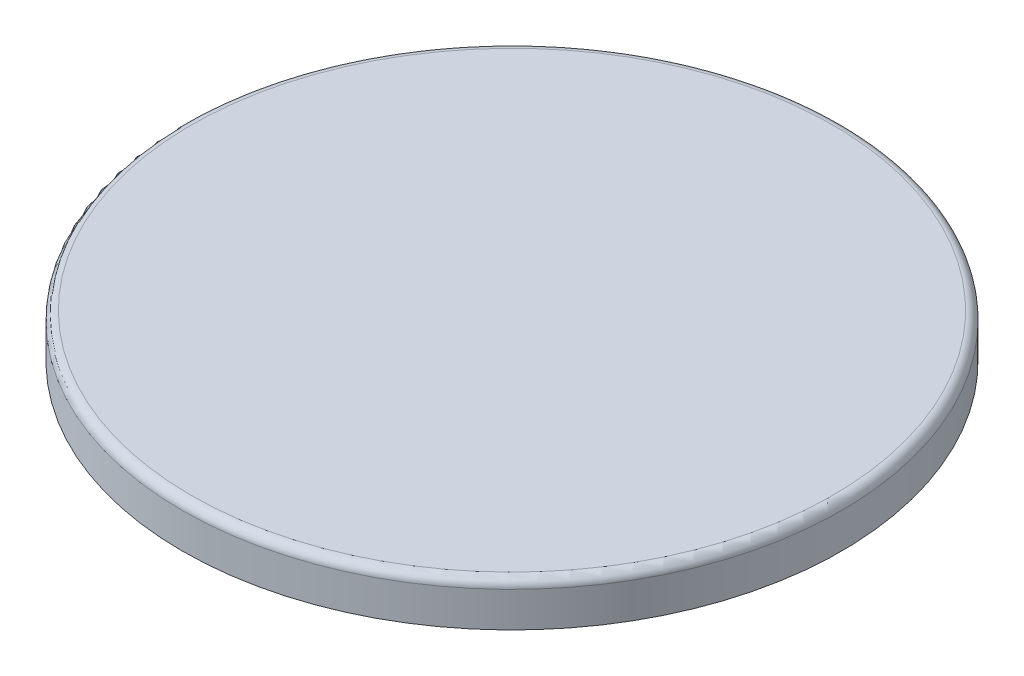
ISO-10303-21;
HEADER;
FILE_DESCRIPTION(('STEP AP214'),'2;1');
FILE_NAME('part.step','',(''),(''),'','','');
FILE_SCHEMA(('AUTOMOTIVE_DESIGN { 1 0 10303 214 1 1 1 1 }'));
ENDSEC;
DATA;
#1=APPLICATION_CONTEXT('core data for automotive mechanical design processes');
#2=APPLICATION_PROTOCOL_DEFINITION('international standard','automotive_design',2000,#1);
#3=PRODUCT_CONTEXT('',#1,'mechanical');
#4=PRODUCT('Part','Part','',(#3));
#5=PRODUCT_RELATED_PRODUCT_CATEGORY('part','',(#4));
#6=PRODUCT_DEFINITION_FORMATION('','',#4);
#7=PRODUCT_DEFINITION_CONTEXT('part definition',#1,'design');
#8=PRODUCT_DEFINITION('design','',#6,#7);
#9=PRODUCT_DEFINITION_SHAPE('','',#8);
#10=(LENGTH_UNIT() NAMED_UNIT(*) SI_UNIT(.MILLI.,.METRE.));
#11=(NAMED_UNIT(*) PLANE_ANGLE_UNIT() SI_UNIT($,.RADIAN.));
#12=(NAMED_UNIT(*) SI_UNIT($,.STERADIAN.) SOLID_ANGLE_UNIT());
#13=UNCERTAINTY_MEASURE_WITH_UNIT(LENGTH_MEASURE(1.E-05),#10,'distance_accuracy_value','');
#14=(GEOMETRIC_REPRESENTATION_CONTEXT(3) GLOBAL_UNCERTAINTY_ASSIGNED_CONTEXT((#13)) GLOBAL_UNIT_ASSIGNED_CONTEXT((#10,
#11,#12)) REPRESENTATION_CONTEXT('',''));
#15=CARTESIAN_POINT('',(0.,0.,0.));
#16=DIRECTION('',(0.,0.,1.));
#17=DIRECTION('',(1.,0.,0.));
#18=AXIS2_PLACEMENT_3D('',#15,#16,#17);
#19=CARTESIAN_POINT('',(0.,2.,0.));
#20=DIRECTION('',(0.,-1.,0.));
#21=DIRECTION('',(0.,0.,-1.));
#22=AXIS2_PLACEMENT_3D('',#19,#20,#21);
#23=CYLINDRICAL_SURFACE('',#22,15.);
#24=CARTESIAN_POINT('',(0.,1.6,0.));
#25=DIRECTION('',(0.,1.,0.));
#26=DIRECTION('',(0.,0.,1.));
#27=AXIS2_PLACEMENT_3D('',#24,#25,#26);
#28=CIRCLE('',#27,15.);
#29=CARTESIAN_POINT('',(0.,1.6,15.));
#30=VERTEX_POINT('',#29);
#31=EDGE_CURVE('E10',#30,#30,#28,.F.);
#32=ORIENTED_EDGE('',*,*,#31,.T.);
#33=EDGE_LOOP('',(#32));
#34=FACE_BOUND('',#33,.T.);
#35=CARTESIAN_POINT('',(0.,0.,0.));
#36=DIRECTION('',(0.,1.,0.));
#37=DIRECTION('',(0.,0.,1.));
#38=AXIS2_PLACEMENT_3D('',#35,#36,#37);
#39=CIRCLE('',#38,15.);
#40=CARTESIAN_POINT('',(0.,0.,15.));
#41=VERTEX_POINT('',#40);
#42=EDGE_CURVE('E44',#41,#41,#39,.T.);
#43=ORIENTED_EDGE('',*,*,#42,.T.);
#44=EDGE_LOOP('',(#43));
#45=FACE_BOUND('',#44,.T.);
#46=ADVANCED_FACE('F33',(#34,#45),#23,.T.);
#47=CARTESIAN_POINT('',(0.,2.,0.));
#48=DIRECTION('',(0.,1.,0.));
#49=DIRECTION('',(0.,0.,1.));
#50=AXIS2_PLACEMENT_3D('',#47,#48,#49);
#51=PLANE('',#50);
#52=CARTESIAN_POINT('',(0.,2.,0.));
#53=DIRECTION('',(0.,1.,0.));
#54=DIRECTION('',(0.,0.,1.));
#55=AXIS2_PLACEMENT_3D('',#52,#53,#54);
#56=CIRCLE('',#55,14.6);
#57=CARTESIAN_POINT('',(0.,2.,14.6));
#58=VERTEX_POINT('',#57);
#59=EDGE_CURVE('E40',#58,#58,#56,.T.);
#60=ORIENTED_EDGE('',*,*,#59,.T.);
#61=EDGE_LOOP('',(#60));
#62=FACE_BOUND('',#61,.T.);
#63=ADVANCED_FACE('F54',(#62),#51,.T.);
#64=CARTESIAN_POINT('',(0.,0.,0.));
#65=DIRECTION('',(0.,1.,0.));
#66=DIRECTION('',(0.,0.,1.));
#67=AXIS2_PLACEMENT_3D('',#64,#65,#66);
#68=PLANE('',#67);
#69=ORIENTED_EDGE('',*,*,#42,.F.);
#70=EDGE_LOOP('',(#69));
#71=FACE_BOUND('',#70,.T.);
#72=ADVANCED_FACE('F52',(#71),#68,.F.);
#73=CARTESIAN_POINT('',(0.,1.6,0.));
#74=DIRECTION('',(0.,1.,0.));
#75=DIRECTION('',(0.,0.,1.));
#76=AXIS2_PLACEMENT_3D('',#73,#74,#75);
#77=TOROIDAL_SURFACE('',#76,14.6,0.4);
#78=ORIENTED_EDGE('',*,*,#31,.F.);
#79=EDGE_LOOP('',(#78));
#80=FACE_BOUND('',#79,.T.);
#81=ORIENTED_EDGE('',*,*,#59,.F.);
#82=EDGE_LOOP('',(#81));
#83=FACE_BOUND('',#82,.T.);
#84=ADVANCED_FACE('F35',(#80,#83),#77,.T.);
#85=CLOSED_SHELL('',(#46,#63,#72,#84));
#86=MANIFOLD_SOLID_BREP('B2',#85);
#87=ADVANCED_BREP_SHAPE_REPRESENTATION('',(#18,#86),#14);
#88=SHAPE_DEFINITION_REPRESENTATION(#9,#87);
ENDSEC;
END-ISO-10303-21;
